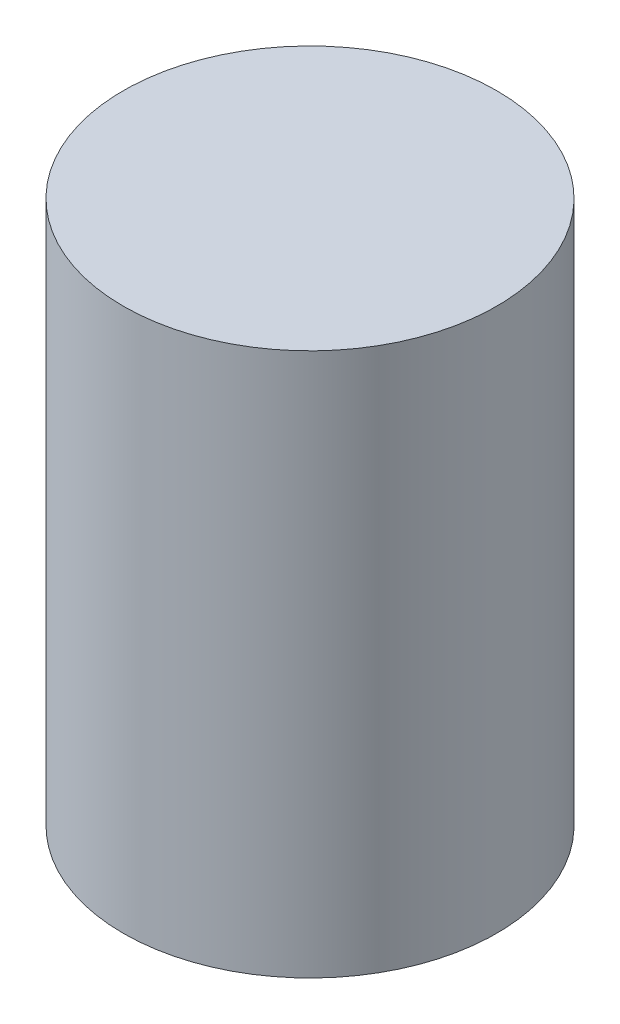
ISO-10303-21;
HEADER;
FILE_DESCRIPTION(('STEP AP214'),'2;1');
FILE_NAME('part.step','',(''),(''),'','','');
FILE_SCHEMA(('AUTOMOTIVE_DESIGN { 1 0 10303 214 1 1 1 1 }'));
ENDSEC;
DATA;
#1=APPLICATION_CONTEXT('core data for automotive mechanical design processes');
#2=APPLICATION_PROTOCOL_DEFINITION('international standard','automotive_design',2000,#1);
#3=PRODUCT_CONTEXT('',#1,'mechanical');
#4=PRODUCT('Part','Part','',(#3));
#5=PRODUCT_RELATED_PRODUCT_CATEGORY('part','',(#4));
#6=PRODUCT_DEFINITION_FORMATION('','',#4);
#7=PRODUCT_DEFINITION_CONTEXT('part definition',#1,'design');
#8=PRODUCT_DEFINITION('design','',#6,#7);
#9=PRODUCT_DEFINITION_SHAPE('','',#8);
#10=(LENGTH_UNIT() NAMED_UNIT(*) SI_UNIT(.MILLI.,.METRE.));
#11=(NAMED_UNIT(*) PLANE_ANGLE_UNIT() SI_UNIT($,.RADIAN.));
#12=(NAMED_UNIT(*) SI_UNIT($,.STERADIAN.) SOLID_ANGLE_UNIT());
#13=UNCERTAINTY_MEASURE_WITH_UNIT(LENGTH_MEASURE(1.E-05),#10,'distance_accuracy_value','');
#14=(GEOMETRIC_REPRESENTATION_CONTEXT(3) GLOBAL_UNCERTAINTY_ASSIGNED_CONTEXT((#13)) GLOBAL_UNIT_ASSIGNED_CONTEXT((#10,
#11,#12)) REPRESENTATION_CONTEXT('',''));
#15=CARTESIAN_POINT('',(0.,0.,0.));
#16=DIRECTION('',(0.,0.,1.));
#17=DIRECTION('',(1.,0.,0.));
#18=AXIS2_PLACEMENT_3D('',#15,#16,#17);
#19=CARTESIAN_POINT('',(0.,4.,0.));
#20=DIRECTION('',(0.,-1.,0.));
#21=DIRECTION('',(0.,0.,-1.));
#22=AXIS2_PLACEMENT_3D('',#19,#20,#21);
#23=CYLINDRICAL_SURFACE('',#22,2.75);
#24=CARTESIAN_POINT('',(0.,4.,0.));
#25=DIRECTION('',(0.,1.,0.));
#26=DIRECTION('',(0.,0.,1.));
#27=AXIS2_PLACEMENT_3D('',#24,#25,#26);
#28=CIRCLE('',#27,2.75);
#29=CARTESIAN_POINT('',(0.,4.,2.75));
#30=VERTEX_POINT('',#29);
#31=EDGE_CURVE('E10',#30,#30,#28,.T.);
#32=ORIENTED_EDGE('',*,*,#31,.F.);
#33=EDGE_LOOP('',(#32));
#34=FACE_BOUND('',#33,.T.);
#35=CARTESIAN_POINT('',(0.,-4.,0.));
#36=DIRECTION('',(0.,1.,0.));
#37=DIRECTION('',(0.,0.,1.));
#38=AXIS2_PLACEMENT_3D('',#35,#36,#37);
#39=CIRCLE('',#38,2.75);
#40=CARTESIAN_POINT('',(0.,-4.,2.75));
#41=VERTEX_POINT('',#40);
#42=EDGE_CURVE('E42',#41,#41,#39,.T.);
#43=ORIENTED_EDGE('',*,*,#42,.T.);
#44=EDGE_LOOP('',(#43));
#45=FACE_BOUND('',#44,.T.);
#46=ADVANCED_FACE('F39',(#34,#45),#23,.T.);
#47=CARTESIAN_POINT('',(0.,4.,0.));
#48=DIRECTION('',(0.,1.,0.));
#49=DIRECTION('',(0.,0.,1.));
#50=AXIS2_PLACEMENT_3D('',#47,#48,#49);
#51=PLANE('',#50);
#52=ORIENTED_EDGE('',*,*,#31,.T.);
#53=EDGE_LOOP('',(#52));
#54=FACE_BOUND('',#53,.T.);
#55=ADVANCED_FACE('F54',(#54),#51,.T.);
#56=CARTESIAN_POINT('',(0.,-4.,0.));
#57=DIRECTION('',(0.,1.,0.));
#58=DIRECTION('',(0.,0.,1.));
#59=AXIS2_PLACEMENT_3D('',#56,#57,#58);
#60=PLANE('',#59);
#61=ORIENTED_EDGE('',*,*,#42,.F.);
#62=EDGE_LOOP('',(#61));
#63=FACE_BOUND('',#62,.T.);
#64=ADVANCED_FACE('F52',(#63),#60,.F.);
#65=CLOSED_SHELL('',(#46,#55,#64));
#66=MANIFOLD_SOLID_BREP('B2',#65);
#67=ADVANCED_BREP_SHAPE_REPRESENTATION('',(#18,#66),#14);
#68=SHAPE_DEFINITION_REPRESENTATION(#9,#67);
ENDSEC;
END-ISO-10303-21;
